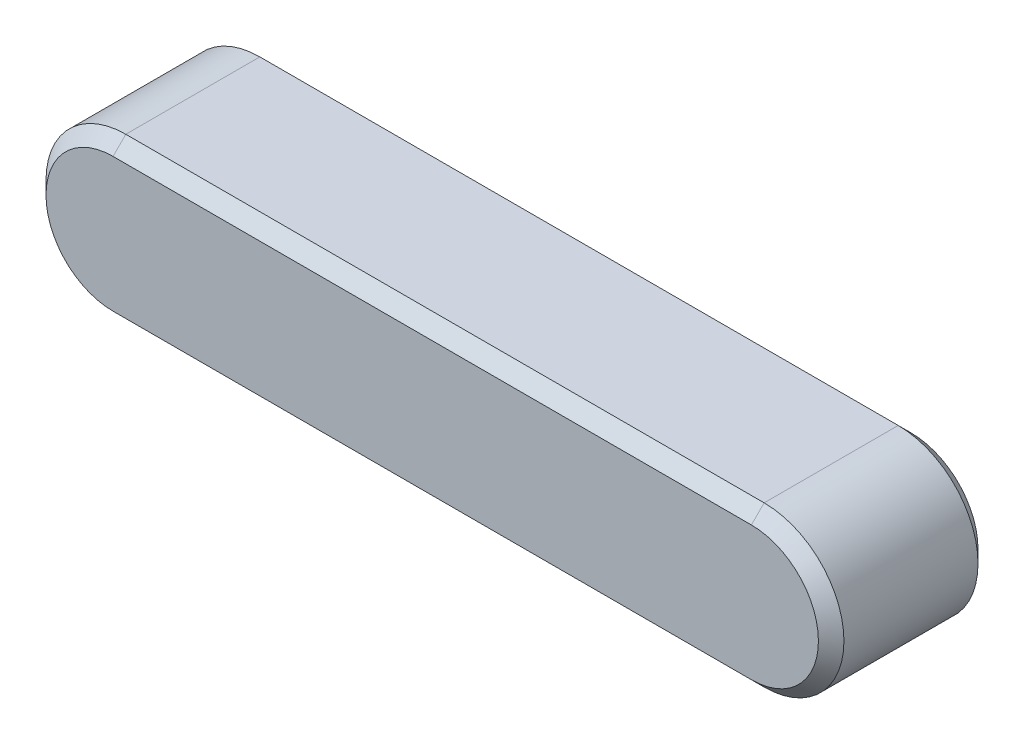
ISO-10303-21;
HEADER;
FILE_DESCRIPTION(('STEP AP214'),'2;1');
FILE_NAME('part.step','',(''),(''),'','','');
FILE_SCHEMA(('AUTOMOTIVE_DESIGN { 1 0 10303 214 1 1 1 1 }'));
ENDSEC;
DATA;
#1=APPLICATION_CONTEXT('core data for automotive mechanical design processes');
#2=APPLICATION_PROTOCOL_DEFINITION('international standard','automotive_design',2000,#1);
#3=PRODUCT_CONTEXT('',#1,'mechanical');
#4=PRODUCT('Part','Part','',(#3));
#5=PRODUCT_RELATED_PRODUCT_CATEGORY('part','',(#4));
#6=PRODUCT_DEFINITION_FORMATION('','',#4);
#7=PRODUCT_DEFINITION_CONTEXT('part definition',#1,'design');
#8=PRODUCT_DEFINITION('design','',#6,#7);
#9=PRODUCT_DEFINITION_SHAPE('','',#8);
#10=(LENGTH_UNIT() NAMED_UNIT(*) SI_UNIT(.MILLI.,.METRE.));
#11=(NAMED_UNIT(*) PLANE_ANGLE_UNIT() SI_UNIT($,.RADIAN.));
#12=(NAMED_UNIT(*) SI_UNIT($,.STERADIAN.) SOLID_ANGLE_UNIT());
#13=UNCERTAINTY_MEASURE_WITH_UNIT(LENGTH_MEASURE(1.E-05),#10,'distance_accuracy_value','');
#14=(GEOMETRIC_REPRESENTATION_CONTEXT(3) GLOBAL_UNCERTAINTY_ASSIGNED_CONTEXT((#13)) GLOBAL_UNIT_ASSIGNED_CONTEXT((#10,
#11,#12)) REPRESENTATION_CONTEXT('',''));
#15=CARTESIAN_POINT('',(0.,0.,0.));
#16=DIRECTION('',(0.,0.,1.));
#17=DIRECTION('',(1.,0.,0.));
#18=AXIS2_PLACEMENT_3D('',#15,#16,#17);
#19=CARTESIAN_POINT('',(-20.,0.,2.5));
#20=DIRECTION('',(0.,0.,-1.));
#21=DIRECTION('',(-1.,0.,0.));
#22=AXIS2_PLACEMENT_3D('',#19,#20,#21);
#23=CYLINDRICAL_SURFACE('',#22,2.5);
#24=DIRECTION('',(0.,0.,-1.));
#25=VECTOR('',#24,1.);
#26=CARTESIAN_POINT('',(-20.,-2.5,2.5));
#27=LINE('',#26,#25);
#28=CARTESIAN_POINT('',(-20.,-2.5,2.1));
#29=VERTEX_POINT('',#28);
#30=CARTESIAN_POINT('',(-20.,-2.5,-2.10000000000001));
#31=VERTEX_POINT('',#30);
#32=EDGE_CURVE('E122',#29,#31,#27,.T.);
#33=ORIENTED_EDGE('',*,*,#32,.F.);
#34=CARTESIAN_POINT('',(-20.,0.,2.1));
#35=DIRECTION('',(0.,0.,-1.));
#36=DIRECTION('',(-1.,0.,0.));
#37=AXIS2_PLACEMENT_3D('',#34,#35,#36);
#38=CIRCLE('',#37,2.5);
#39=CARTESIAN_POINT('',(-20.,2.5,2.1));
#40=VERTEX_POINT('',#39);
#41=EDGE_CURVE('E56',#29,#40,#38,.T.);
#42=ORIENTED_EDGE('',*,*,#41,.T.);
#43=DIRECTION('',(0.,0.,-1.));
#44=VECTOR('',#43,1.);
#45=CARTESIAN_POINT('',(-20.,2.5,2.5));
#46=LINE('',#45,#44);
#47=CARTESIAN_POINT('',(-20.,2.5,-2.10000000000001));
#48=VERTEX_POINT('',#47);
#49=EDGE_CURVE('E160',#40,#48,#46,.T.);
#50=ORIENTED_EDGE('',*,*,#49,.T.);
#51=CARTESIAN_POINT('',(-20.,0.,-2.10000000000001));
#52=DIRECTION('',(0.,0.,-1.));
#53=DIRECTION('',(-1.,0.,0.));
#54=AXIS2_PLACEMENT_3D('',#51,#52,#53);
#55=CIRCLE('',#54,2.5);
#56=EDGE_CURVE('E110',#48,#31,#55,.F.);
#57=ORIENTED_EDGE('',*,*,#56,.T.);
#58=EDGE_LOOP('',(#33,#42,#50,#57));
#59=FACE_BOUND('',#58,.T.);
#60=ADVANCED_FACE('F33',(#59),#23,.T.);
#61=CARTESIAN_POINT('',(0.,-2.5,2.5));
#62=DIRECTION('',(0.,1.,0.));
#63=DIRECTION('',(-1.,0.,0.));
#64=AXIS2_PLACEMENT_3D('',#61,#62,#63);
#65=PLANE('',#64);
#66=ORIENTED_EDGE('',*,*,#32,.T.);
#67=DIRECTION('',(1.,0.,0.));
#68=VECTOR('',#67,1.);
#69=CARTESIAN_POINT('',(0.,-2.5,-2.10000000000001));
#70=LINE('',#69,#68);
#71=CARTESIAN_POINT('',(0.,-2.5,-2.10000000000001));
#72=VERTEX_POINT('',#71);
#73=EDGE_CURVE('E121',#31,#72,#70,.T.);
#74=ORIENTED_EDGE('',*,*,#73,.T.);
#75=DIRECTION('',(0.,0.,-1.));
#76=VECTOR('',#75,1.);
#77=CARTESIAN_POINT('',(0.,-2.5,2.5));
#78=LINE('',#77,#76);
#79=CARTESIAN_POINT('',(0.,-2.5,2.1));
#80=VERTEX_POINT('',#79);
#81=EDGE_CURVE('E104',#80,#72,#78,.T.);
#82=ORIENTED_EDGE('',*,*,#81,.F.);
#83=DIRECTION('',(-1.,0.,0.));
#84=VECTOR('',#83,1.);
#85=CARTESIAN_POINT('',(0.,-2.5,2.1));
#86=LINE('',#85,#84);
#87=EDGE_CURVE('E119',#80,#29,#86,.T.);
#88=ORIENTED_EDGE('',*,*,#87,.T.);
#89=EDGE_LOOP('',(#66,#74,#82,#88));
#90=FACE_BOUND('',#89,.T.);
#91=ADVANCED_FACE('F118',(#90),#65,.F.);
#92=CARTESIAN_POINT('',(0.,0.,2.5));
#93=DIRECTION('',(0.,0.,-1.));
#94=DIRECTION('',(-1.,0.,0.));
#95=AXIS2_PLACEMENT_3D('',#92,#93,#94);
#96=CYLINDRICAL_SURFACE('',#95,2.5);
#97=DIRECTION('',(0.,0.,-1.));
#98=VECTOR('',#97,1.);
#99=CARTESIAN_POINT('',(0.,2.5,2.5));
#100=LINE('',#99,#98);
#101=CARTESIAN_POINT('',(0.,2.5,2.1));
#102=VERTEX_POINT('',#101);
#103=CARTESIAN_POINT('',(0.,2.5,-2.10000000000001));
#104=VERTEX_POINT('',#103);
#105=EDGE_CURVE('E105',#102,#104,#100,.T.);
#106=ORIENTED_EDGE('',*,*,#105,.F.);
#107=CARTESIAN_POINT('',(0.,0.,2.1));
#108=DIRECTION('',(0.,0.,-1.));
#109=DIRECTION('',(-1.,0.,0.));
#110=AXIS2_PLACEMENT_3D('',#107,#108,#109);
#111=CIRCLE('',#110,2.5);
#112=EDGE_CURVE('E101',#102,#80,#111,.T.);
#113=ORIENTED_EDGE('',*,*,#112,.T.);
#114=ORIENTED_EDGE('',*,*,#81,.T.);
#115=CARTESIAN_POINT('',(0.,0.,-2.10000000000001));
#116=DIRECTION('',(0.,0.,-1.));
#117=DIRECTION('',(-1.,0.,0.));
#118=AXIS2_PLACEMENT_3D('',#115,#116,#117);
#119=CIRCLE('',#118,2.5);
#120=EDGE_CURVE('E111',#72,#104,#119,.F.);
#121=ORIENTED_EDGE('',*,*,#120,.T.);
#122=EDGE_LOOP('',(#106,#113,#114,#121));
#123=FACE_BOUND('',#122,.T.);
#124=ADVANCED_FACE('F103',(#123),#96,.T.);
#125=CARTESIAN_POINT('',(-20.,2.5,2.5));
#126=DIRECTION('',(0.,-1.,0.));
#127=DIRECTION('',(1.,0.,0.));
#128=AXIS2_PLACEMENT_3D('',#125,#126,#127);
#129=PLANE('',#128);
#130=ORIENTED_EDGE('',*,*,#49,.F.);
#131=DIRECTION('',(1.,0.,0.));
#132=VECTOR('',#131,1.);
#133=CARTESIAN_POINT('',(-20.,2.5,2.1));
#134=LINE('',#133,#132);
#135=EDGE_CURVE('E11',#40,#102,#134,.T.);
#136=ORIENTED_EDGE('',*,*,#135,.T.);
#137=ORIENTED_EDGE('',*,*,#105,.T.);
#138=DIRECTION('',(-1.,0.,0.));
#139=VECTOR('',#138,1.);
#140=CARTESIAN_POINT('',(-20.,2.5,-2.10000000000001));
#141=LINE('',#140,#139);
#142=EDGE_CURVE('E42',#104,#48,#141,.T.);
#143=ORIENTED_EDGE('',*,*,#142,.T.);
#144=EDGE_LOOP('',(#130,#136,#137,#143));
#145=FACE_BOUND('',#144,.T.);
#146=ADVANCED_FACE('F210',(#145),#129,.F.);
#147=CARTESIAN_POINT('',(-20.,0.,2.5));
#148=DIRECTION('',(0.,0.,-1.));
#149=DIRECTION('',(-1.,0.,0.));
#150=AXIS2_PLACEMENT_3D('',#147,#148,#149);
#151=PLANE('',#150);
#152=CARTESIAN_POINT('',(-20.,0.,2.5));
#153=DIRECTION('',(0.,0.,-1.));
#154=DIRECTION('',(-1.,0.,0.));
#155=AXIS2_PLACEMENT_3D('',#152,#153,#154);
#156=CIRCLE('',#155,2.10000000000001);
#157=CARTESIAN_POINT('',(-20.,2.10000000000001,2.5));
#158=VERTEX_POINT('',#157);
#159=CARTESIAN_POINT('',(-20.,-2.10000000000001,2.5));
#160=VERTEX_POINT('',#159);
#161=EDGE_CURVE('E181',#158,#160,#156,.F.);
#162=ORIENTED_EDGE('',*,*,#161,.T.);
#163=DIRECTION('',(1.,0.,0.));
#164=VECTOR('',#163,1.);
#165=CARTESIAN_POINT('',(-20.,-2.10000000000001,2.5));
#166=LINE('',#165,#164);
#167=CARTESIAN_POINT('',(0.,-2.10000000000001,2.5));
#168=VERTEX_POINT('',#167);
#169=EDGE_CURVE('E184',#160,#168,#166,.T.);
#170=ORIENTED_EDGE('',*,*,#169,.T.);
#171=CARTESIAN_POINT('',(0.,0.,2.5));
#172=DIRECTION('',(0.,0.,-1.));
#173=DIRECTION('',(-1.,0.,0.));
#174=AXIS2_PLACEMENT_3D('',#171,#172,#173);
#175=CIRCLE('',#174,2.10000000000001);
#176=CARTESIAN_POINT('',(0.,2.10000000000001,2.5));
#177=VERTEX_POINT('',#176);
#178=EDGE_CURVE('E133',#168,#177,#175,.F.);
#179=ORIENTED_EDGE('',*,*,#178,.T.);
#180=DIRECTION('',(-1.,0.,0.));
#181=VECTOR('',#180,1.);
#182=CARTESIAN_POINT('',(-20.,2.10000000000001,2.5));
#183=LINE('',#182,#181);
#184=EDGE_CURVE('E179',#177,#158,#183,.T.);
#185=ORIENTED_EDGE('',*,*,#184,.T.);
#186=EDGE_LOOP('',(#162,#170,#179,#185));
#187=FACE_BOUND('',#186,.T.);
#188=ADVANCED_FACE('F213',(#187),#151,.F.);
#189=CARTESIAN_POINT('',(-20.,0.,-2.5));
#190=DIRECTION('',(0.,0.,-1.));
#191=DIRECTION('',(-1.,0.,0.));
#192=AXIS2_PLACEMENT_3D('',#189,#190,#191);
#193=PLANE('',#192);
#194=CARTESIAN_POINT('',(0.,0.,-2.5));
#195=DIRECTION('',(0.,0.,-1.));
#196=DIRECTION('',(-1.,0.,0.));
#197=AXIS2_PLACEMENT_3D('',#194,#195,#196);
#198=CIRCLE('',#197,2.1);
#199=CARTESIAN_POINT('',(0.,2.1,-2.5));
#200=VERTEX_POINT('',#199);
#201=CARTESIAN_POINT('',(0.,-2.1,-2.5));
#202=VERTEX_POINT('',#201);
#203=EDGE_CURVE('E174',#200,#202,#198,.T.);
#204=ORIENTED_EDGE('',*,*,#203,.T.);
#205=DIRECTION('',(-1.,0.,0.));
#206=VECTOR('',#205,1.);
#207=CARTESIAN_POINT('',(-20.,-2.10000000000001,-2.5));
#208=LINE('',#207,#206);
#209=CARTESIAN_POINT('',(-20.,-2.1,-2.5));
#210=VERTEX_POINT('',#209);
#211=EDGE_CURVE('E176',#202,#210,#208,.T.);
#212=ORIENTED_EDGE('',*,*,#211,.T.);
#213=CARTESIAN_POINT('',(-20.,0.,-2.5));
#214=DIRECTION('',(0.,0.,-1.));
#215=DIRECTION('',(-1.,0.,0.));
#216=AXIS2_PLACEMENT_3D('',#213,#214,#215);
#217=CIRCLE('',#216,2.1);
#218=CARTESIAN_POINT('',(-20.,2.1,-2.5));
#219=VERTEX_POINT('',#218);
#220=EDGE_CURVE('E172',#210,#219,#217,.T.);
#221=ORIENTED_EDGE('',*,*,#220,.T.);
#222=DIRECTION('',(1.,0.,0.));
#223=VECTOR('',#222,1.);
#224=CARTESIAN_POINT('',(0.,2.1,-2.5));
#225=LINE('',#224,#223);
#226=EDGE_CURVE('E170',#219,#200,#225,.T.);
#227=ORIENTED_EDGE('',*,*,#226,.T.);
#228=EDGE_LOOP('',(#204,#212,#221,#227));
#229=FACE_BOUND('',#228,.T.);
#230=ADVANCED_FACE('F214',(#229),#193,.T.);
#231=CARTESIAN_POINT('',(-20.,2.5,-2.10000000000001));
#232=DIRECTION('',(0.,0.707106781186544,-0.707106781186551));
#233=DIRECTION('',(0.,0.707106781186551,0.707106781186544));
#234=AXIS2_PLACEMENT_3D('',#231,#232,#233);
#235=PLANE('',#234);
#236=DIRECTION('',(0.,0.707106781186551,0.707106781186544));
#237=VECTOR('',#236,1.);
#238=CARTESIAN_POINT('',(0.,2.1,-2.5));
#239=LINE('',#238,#237);
#240=EDGE_CURVE('E152',#200,#104,#239,.T.);
#241=ORIENTED_EDGE('',*,*,#240,.F.);
#242=ORIENTED_EDGE('',*,*,#226,.F.);
#243=DIRECTION('',(0.,-0.707106781186551,-0.707106781186544));
#244=VECTOR('',#243,1.);
#245=CARTESIAN_POINT('',(-20.,2.5,-2.10000000000001));
#246=LINE('',#245,#244);
#247=EDGE_CURVE('E139',#48,#219,#246,.T.);
#248=ORIENTED_EDGE('',*,*,#247,.F.);
#249=ORIENTED_EDGE('',*,*,#142,.F.);
#250=EDGE_LOOP('',(#241,#242,#248,#249));
#251=FACE_BOUND('',#250,.T.);
#252=ADVANCED_FACE('F217',(#251),#235,.T.);
#253=CARTESIAN_POINT('',(-20.,0.,-2.10000000000001));
#254=DIRECTION('',(0.,0.,1.));
#255=DIRECTION('',(1.,0.,0.));
#256=AXIS2_PLACEMENT_3D('',#253,#254,#255);
#257=CONICAL_SURFACE('',#256,2.5,0.785398163397453);
#258=ORIENTED_EDGE('',*,*,#247,.T.);
#259=ORIENTED_EDGE('',*,*,#220,.F.);
#260=DIRECTION('',(0.,0.707106781186551,-0.707106781186544));
#261=VECTOR('',#260,1.);
#262=CARTESIAN_POINT('',(-20.,-2.5,-2.10000000000001));
#263=LINE('',#262,#261);
#264=EDGE_CURVE('E146',#31,#210,#263,.T.);
#265=ORIENTED_EDGE('',*,*,#264,.F.);
#266=ORIENTED_EDGE('',*,*,#56,.F.);
#267=EDGE_LOOP('',(#258,#259,#265,#266));
#268=FACE_BOUND('',#267,.T.);
#269=ADVANCED_FACE('F189',(#268),#257,.T.);
#270=CARTESIAN_POINT('',(0.,0.,-2.10000000000001));
#271=DIRECTION('',(0.,0.,1.));
#272=DIRECTION('',(1.,0.,0.));
#273=AXIS2_PLACEMENT_3D('',#270,#271,#272);
#274=CONICAL_SURFACE('',#273,2.5,0.785398163397453);
#275=ORIENTED_EDGE('',*,*,#240,.T.);
#276=ORIENTED_EDGE('',*,*,#120,.F.);
#277=DIRECTION('',(0.,-0.707106781186551,0.707106781186544));
#278=VECTOR('',#277,1.);
#279=CARTESIAN_POINT('',(0.,-2.1,-2.5));
#280=LINE('',#279,#278);
#281=EDGE_CURVE('E142',#202,#72,#280,.T.);
#282=ORIENTED_EDGE('',*,*,#281,.F.);
#283=ORIENTED_EDGE('',*,*,#203,.F.);
#284=EDGE_LOOP('',(#275,#276,#282,#283));
#285=FACE_BOUND('',#284,.T.);
#286=ADVANCED_FACE('F192',(#285),#274,.T.);
#287=CARTESIAN_POINT('',(0.,-2.5,-2.10000000000001));
#288=DIRECTION('',(0.,-0.707106781186544,-0.707106781186551));
#289=DIRECTION('',(0.,0.707106781186551,-0.707106781186544));
#290=AXIS2_PLACEMENT_3D('',#287,#288,#289);
#291=PLANE('',#290);
#292=ORIENTED_EDGE('',*,*,#264,.T.);
#293=ORIENTED_EDGE('',*,*,#211,.F.);
#294=ORIENTED_EDGE('',*,*,#281,.T.);
#295=ORIENTED_EDGE('',*,*,#73,.F.);
#296=EDGE_LOOP('',(#292,#293,#294,#295));
#297=FACE_BOUND('',#296,.T.);
#298=ADVANCED_FACE('F190',(#297),#291,.T.);
#299=CARTESIAN_POINT('',(-20.,2.10000000000001,2.5));
#300=DIRECTION('',(0.,-0.707106781186551,-0.707106781186544));
#301=DIRECTION('',(0.,0.707106781186544,-0.707106781186551));
#302=AXIS2_PLACEMENT_3D('',#299,#300,#301);
#303=PLANE('',#302);
#304=DIRECTION('',(0.,-0.707106781186544,0.707106781186551));
#305=VECTOR('',#304,1.);
#306=CARTESIAN_POINT('',(0.,2.5,2.1));
#307=LINE('',#306,#305);
#308=EDGE_CURVE('E136',#102,#177,#307,.T.);
#309=ORIENTED_EDGE('',*,*,#308,.F.);
#310=ORIENTED_EDGE('',*,*,#135,.F.);
#311=DIRECTION('',(0.,0.707106781186544,-0.707106781186551));
#312=VECTOR('',#311,1.);
#313=CARTESIAN_POINT('',(-20.,2.10000000000001,2.5));
#314=LINE('',#313,#312);
#315=EDGE_CURVE('E37',#158,#40,#314,.T.);
#316=ORIENTED_EDGE('',*,*,#315,.F.);
#317=ORIENTED_EDGE('',*,*,#184,.F.);
#318=EDGE_LOOP('',(#309,#310,#316,#317));
#319=FACE_BOUND('',#318,.T.);
#320=ADVANCED_FACE('F35',(#319),#303,.F.);
#321=CARTESIAN_POINT('',(-20.,0.,2.5));
#322=DIRECTION('',(0.,0.,-1.));
#323=DIRECTION('',(-1.,0.,0.));
#324=AXIS2_PLACEMENT_3D('',#321,#322,#323);
#325=CONICAL_SURFACE('',#324,2.10000000000001,0.785398163397444);
#326=ORIENTED_EDGE('',*,*,#315,.T.);
#327=ORIENTED_EDGE('',*,*,#41,.F.);
#328=DIRECTION('',(0.,-0.707106781186544,-0.707106781186551));
#329=VECTOR('',#328,1.);
#330=CARTESIAN_POINT('',(-20.,-2.10000000000001,2.5));
#331=LINE('',#330,#329);
#332=EDGE_CURVE('E130',#160,#29,#331,.T.);
#333=ORIENTED_EDGE('',*,*,#332,.F.);
#334=ORIENTED_EDGE('',*,*,#161,.F.);
#335=EDGE_LOOP('',(#326,#327,#333,#334));
#336=FACE_BOUND('',#335,.T.);
#337=ADVANCED_FACE('F198',(#336),#325,.T.);
#338=CARTESIAN_POINT('',(0.,0.,2.5));
#339=DIRECTION('',(0.,0.,-1.));
#340=DIRECTION('',(-1.,0.,0.));
#341=AXIS2_PLACEMENT_3D('',#338,#339,#340);
#342=CONICAL_SURFACE('',#341,2.10000000000001,0.785398163397444);
#343=ORIENTED_EDGE('',*,*,#308,.T.);
#344=ORIENTED_EDGE('',*,*,#178,.F.);
#345=DIRECTION('',(0.,0.707106781186544,0.707106781186551));
#346=VECTOR('',#345,1.);
#347=CARTESIAN_POINT('',(0.,-2.5,2.1));
#348=LINE('',#347,#346);
#349=EDGE_CURVE('E127',#80,#168,#348,.T.);
#350=ORIENTED_EDGE('',*,*,#349,.F.);
#351=ORIENTED_EDGE('',*,*,#112,.F.);
#352=EDGE_LOOP('',(#343,#344,#350,#351));
#353=FACE_BOUND('',#352,.T.);
#354=ADVANCED_FACE('F132',(#353),#342,.T.);
#355=CARTESIAN_POINT('',(-20.,-2.10000000000001,2.5));
#356=DIRECTION('',(0.,0.707106781186551,-0.707106781186544));
#357=DIRECTION('',(0.,0.707106781186544,0.707106781186551));
#358=AXIS2_PLACEMENT_3D('',#355,#356,#357);
#359=PLANE('',#358);
#360=ORIENTED_EDGE('',*,*,#332,.T.);
#361=ORIENTED_EDGE('',*,*,#87,.F.);
#362=ORIENTED_EDGE('',*,*,#349,.T.);
#363=ORIENTED_EDGE('',*,*,#169,.F.);
#364=EDGE_LOOP('',(#360,#361,#362,#363));
#365=FACE_BOUND('',#364,.T.);
#366=ADVANCED_FACE('F125',(#365),#359,.F.);
#367=CLOSED_SHELL('',(#60,#91,#124,#146,#188,#230,#252,#269,#286,#298,#320,#337,#354,#366));
#368=MANIFOLD_SOLID_BREP('B2',#367);
#369=ADVANCED_BREP_SHAPE_REPRESENTATION('',(#18,#368),#14);
#370=SHAPE_DEFINITION_REPRESENTATION(#9,#369);
ENDSEC;
END-ISO-10303-21;
